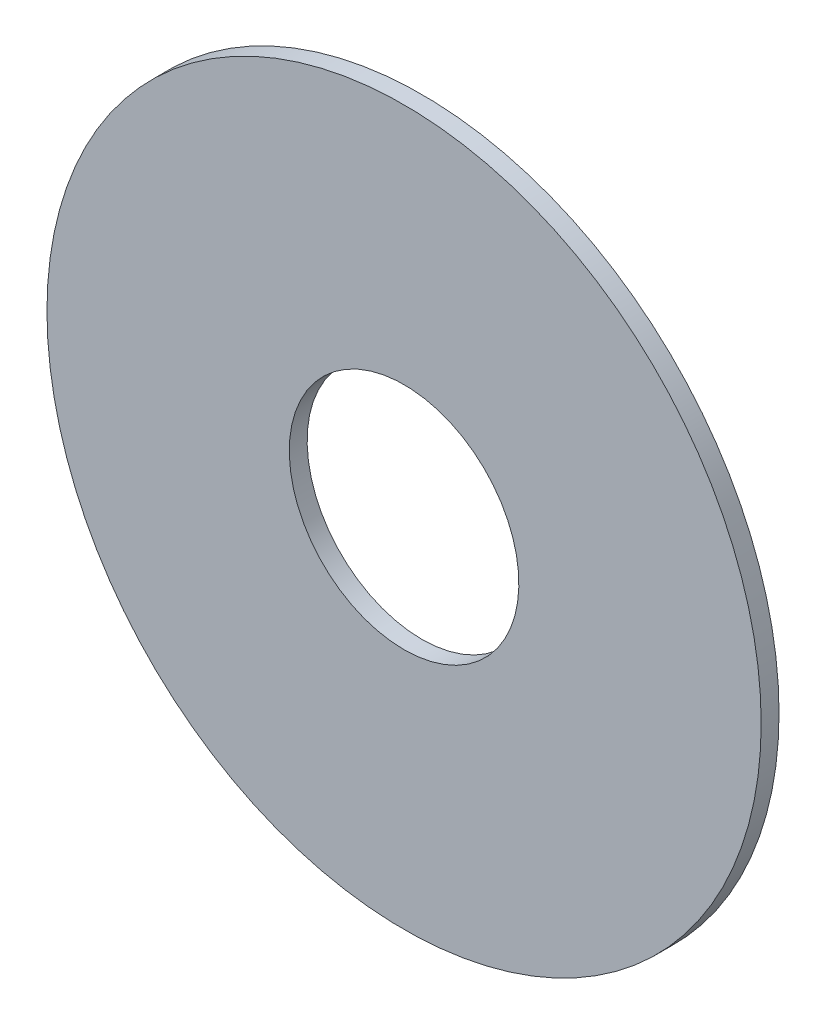
ISO-10303-21;
HEADER;
FILE_DESCRIPTION(('STEP AP214'),'2;1');
FILE_NAME('part.step','',(''),(''),'','','');
FILE_SCHEMA(('AUTOMOTIVE_DESIGN { 1 0 10303 214 1 1 1 1 }'));
ENDSEC;
DATA;
#1=APPLICATION_CONTEXT('core data for automotive mechanical design processes');
#2=APPLICATION_PROTOCOL_DEFINITION('international standard','automotive_design',2000,#1);
#3=PRODUCT_CONTEXT('',#1,'mechanical');
#4=PRODUCT('Part','Part','',(#3));
#5=PRODUCT_RELATED_PRODUCT_CATEGORY('part','',(#4));
#6=PRODUCT_DEFINITION_FORMATION('','',#4);
#7=PRODUCT_DEFINITION_CONTEXT('part definition',#1,'design');
#8=PRODUCT_DEFINITION('design','',#6,#7);
#9=PRODUCT_DEFINITION_SHAPE('','',#8);
#10=(LENGTH_UNIT() NAMED_UNIT(*) SI_UNIT(.MILLI.,.METRE.));
#11=(NAMED_UNIT(*) PLANE_ANGLE_UNIT() SI_UNIT($,.RADIAN.));
#12=(NAMED_UNIT(*) SI_UNIT($,.STERADIAN.) SOLID_ANGLE_UNIT());
#13=UNCERTAINTY_MEASURE_WITH_UNIT(LENGTH_MEASURE(1.E-05),#10,'distance_accuracy_value','');
#14=(GEOMETRIC_REPRESENTATION_CONTEXT(3) GLOBAL_UNCERTAINTY_ASSIGNED_CONTEXT((#13)) GLOBAL_UNIT_ASSIGNED_CONTEXT((#10,
#11,#12)) REPRESENTATION_CONTEXT('',''));
#15=CARTESIAN_POINT('',(0.,0.,0.));
#16=DIRECTION('',(0.,0.,1.));
#17=DIRECTION('',(1.,0.,0.));
#18=AXIS2_PLACEMENT_3D('',#15,#16,#17);
#19=CARTESIAN_POINT('',(120.16,-84.46,-0.045));
#20=DIRECTION('',(0.,0.,-1.));
#21=DIRECTION('',(0.,-1.,0.));
#22=AXIS2_PLACEMENT_3D('',#19,#20,#21);
#23=CYLINDRICAL_SURFACE('',#22,0.225);
#24=CARTESIAN_POINT('',(120.16,-84.46,1.6));
#25=DIRECTION('',(0.,0.,-1.));
#26=DIRECTION('',(0.,-1.,0.));
#27=AXIS2_PLACEMENT_3D('',#24,#25,#26);
#28=CIRCLE('',#27,0.225);
#29=CARTESIAN_POINT('',(120.16,-84.685,1.6));
#30=VERTEX_POINT('',#29);
#31=EDGE_CURVE('E20',#30,#30,#28,.T.);
#32=ORIENTED_EDGE('',*,*,#31,.T.);
#33=DIRECTION('',(0.,0.,1.));
#34=VECTOR('',#33,1.);
#35=CARTESIAN_POINT('',(120.16,-84.685,-0.045));
#36=LINE('',#35,#34);
#37=CARTESIAN_POINT('',(120.16,-84.685,1.635));
#38=VERTEX_POINT('',#37);
#39=EDGE_CURVE('E11',#30,#38,#36,.T.);
#40=ORIENTED_EDGE('',*,*,#39,.T.);
#41=CARTESIAN_POINT('',(120.16,-84.46,1.635));
#42=DIRECTION('',(0.,0.,-1.));
#43=DIRECTION('',(0.,-1.,0.));
#44=AXIS2_PLACEMENT_3D('',#41,#42,#43);
#45=CIRCLE('',#44,0.225);
#46=EDGE_CURVE('E56',#38,#38,#45,.T.);
#47=ORIENTED_EDGE('',*,*,#46,.F.);
#48=ORIENTED_EDGE('',*,*,#39,.F.);
#49=EDGE_LOOP('',(#32,#40,#47,#48));
#50=FACE_BOUND('',#49,.T.);
#51=ADVANCED_FACE('F17',(#50),#23,.F.);
#52=CARTESIAN_POINT('',(120.16,-84.46,1.6));
#53=DIRECTION('',(0.,0.,1.));
#54=DIRECTION('',(1.,0.,0.));
#55=AXIS2_PLACEMENT_3D('',#52,#53,#54);
#56=PLANE('',#55);
#57=ORIENTED_EDGE('',*,*,#31,.F.);
#58=EDGE_LOOP('',(#57));
#59=FACE_BOUND('',#58,.T.);
#60=CARTESIAN_POINT('',(120.16,-84.46,1.6));
#61=DIRECTION('',(0.,0.,1.));
#62=DIRECTION('',(1.,0.,0.));
#63=AXIS2_PLACEMENT_3D('',#60,#61,#62);
#64=CIRCLE('',#63,0.7);
#65=CARTESIAN_POINT('',(120.86,-84.46,1.6));
#66=VERTEX_POINT('',#65);
#67=EDGE_CURVE('E49',#66,#66,#64,.T.);
#68=ORIENTED_EDGE('',*,*,#67,.F.);
#69=EDGE_LOOP('',(#68));
#70=FACE_BOUND('',#69,.T.);
#71=ADVANCED_FACE('F73',(#59,#70),#56,.F.);
#72=CARTESIAN_POINT('',(120.16,-84.46,1.635));
#73=DIRECTION('',(0.,0.,1.));
#74=DIRECTION('',(1.,0.,0.));
#75=AXIS2_PLACEMENT_3D('',#72,#73,#74);
#76=PLANE('',#75);
#77=ORIENTED_EDGE('',*,*,#46,.T.);
#78=EDGE_LOOP('',(#77));
#79=FACE_BOUND('',#78,.T.);
#80=CARTESIAN_POINT('',(120.16,-84.46,1.635));
#81=DIRECTION('',(0.,0.,1.));
#82=DIRECTION('',(1.,0.,0.));
#83=AXIS2_PLACEMENT_3D('',#80,#81,#82);
#84=CIRCLE('',#83,0.7);
#85=CARTESIAN_POINT('',(120.86,-84.46,1.635));
#86=VERTEX_POINT('',#85);
#87=EDGE_CURVE('E64',#86,#86,#84,.T.);
#88=ORIENTED_EDGE('',*,*,#87,.T.);
#89=EDGE_LOOP('',(#88));
#90=FACE_BOUND('',#89,.T.);
#91=ADVANCED_FACE('F71',(#79,#90),#76,.T.);
#92=CARTESIAN_POINT('',(120.16,-84.46,1.6));
#93=DIRECTION('',(0.,0.,1.));
#94=DIRECTION('',(1.,0.,0.));
#95=AXIS2_PLACEMENT_3D('',#92,#93,#94);
#96=CYLINDRICAL_SURFACE('',#95,0.7);
#97=ORIENTED_EDGE('',*,*,#87,.F.);
#98=DIRECTION('',(0.,0.,1.));
#99=VECTOR('',#98,1.);
#100=CARTESIAN_POINT('',(120.86,-84.46,1.6));
#101=LINE('',#100,#99);
#102=EDGE_CURVE('E52',#66,#86,#101,.T.);
#103=ORIENTED_EDGE('',*,*,#102,.F.);
#104=ORIENTED_EDGE('',*,*,#67,.T.);
#105=ORIENTED_EDGE('',*,*,#102,.T.);
#106=EDGE_LOOP('',(#97,#103,#104,#105));
#107=FACE_BOUND('',#106,.T.);
#108=ADVANCED_FACE('F51',(#107),#96,.T.);
#109=CLOSED_SHELL('',(#51,#71,#91,#108));
#110=MANIFOLD_SOLID_BREP('B1',#109);
#111=ADVANCED_BREP_SHAPE_REPRESENTATION('',(#18,#110),#14);
#112=SHAPE_DEFINITION_REPRESENTATION(#9,#111);
ENDSEC;
END-ISO-10303-21;
